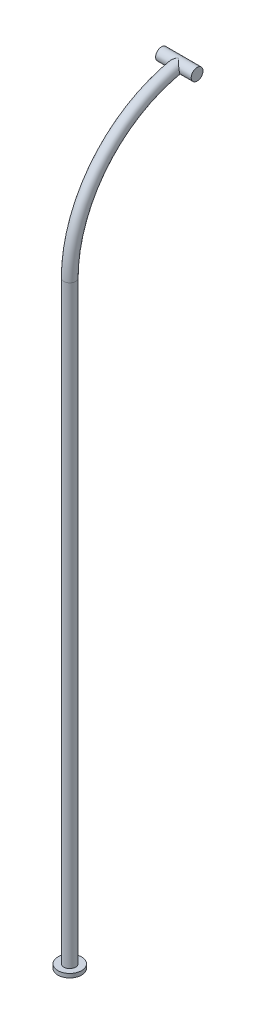
ISO-10303-21;
HEADER;
FILE_DESCRIPTION(('STEP AP214'),'2;1');
FILE_NAME('part.step','',(''),(''),'','','');
FILE_SCHEMA(('AUTOMOTIVE_DESIGN { 1 0 10303 214 1 1 1 1 }'));
ENDSEC;
DATA;
#1=APPLICATION_CONTEXT('core data for automotive mechanical design processes');
#2=APPLICATION_PROTOCOL_DEFINITION('international standard','automotive_design',2000,#1);
#3=PRODUCT_CONTEXT('',#1,'mechanical');
#4=PRODUCT('Part','Part','',(#3));
#5=PRODUCT_RELATED_PRODUCT_CATEGORY('part','',(#4));
#6=PRODUCT_DEFINITION_FORMATION('','',#4);
#7=PRODUCT_DEFINITION_CONTEXT('part definition',#1,'design');
#8=PRODUCT_DEFINITION('design','',#6,#7);
#9=PRODUCT_DEFINITION_SHAPE('','',#8);
#10=(LENGTH_UNIT() NAMED_UNIT(*) SI_UNIT(.MILLI.,.METRE.));
#11=(NAMED_UNIT(*) PLANE_ANGLE_UNIT() SI_UNIT($,.RADIAN.));
#12=(NAMED_UNIT(*) SI_UNIT($,.STERADIAN.) SOLID_ANGLE_UNIT());
#13=UNCERTAINTY_MEASURE_WITH_UNIT(LENGTH_MEASURE(1.E-05),#10,'distance_accuracy_value','');
#14=(GEOMETRIC_REPRESENTATION_CONTEXT(3) GLOBAL_UNCERTAINTY_ASSIGNED_CONTEXT((#13)) GLOBAL_UNIT_ASSIGNED_CONTEXT((#10,
#11,#12)) REPRESENTATION_CONTEXT('',''));
#15=CARTESIAN_POINT('',(0.,0.,0.));
#16=DIRECTION('',(0.,0.,1.));
#17=DIRECTION('',(1.,0.,0.));
#18=AXIS2_PLACEMENT_3D('',#15,#16,#17);
#19=CARTESIAN_POINT('',(0.,150.,0.));
#20=DIRECTION('',(0.,-1.,0.));
#21=DIRECTION('',(0.,0.,-1.));
#22=AXIS2_PLACEMENT_3D('',#19,#20,#21);
#23=CYLINDRICAL_SURFACE('',#22,1.5);
#24=CARTESIAN_POINT('',(0.,150.,0.));
#25=DIRECTION('',(0.,1.,0.));
#26=DIRECTION('',(0.,0.,1.));
#27=AXIS2_PLACEMENT_3D('',#24,#25,#26);
#28=CIRCLE('',#27,1.5);
#29=CARTESIAN_POINT('',(0.,150.,1.5));
#30=VERTEX_POINT('',#29);
#31=EDGE_CURVE('E11',#30,#30,#28,.T.);
#32=ORIENTED_EDGE('',*,*,#31,.F.);
#33=EDGE_LOOP('',(#32));
#34=FACE_BOUND('',#33,.T.);
#35=CARTESIAN_POINT('',(0.,0.,0.));
#36=DIRECTION('',(0.,1.,0.));
#37=DIRECTION('',(0.,0.,1.));
#38=AXIS2_PLACEMENT_3D('',#35,#36,#37);
#39=CIRCLE('',#38,1.5);
#40=CARTESIAN_POINT('',(0.,0.,1.5));
#41=VERTEX_POINT('',#40);
#42=EDGE_CURVE('E35',#41,#41,#39,.T.);
#43=ORIENTED_EDGE('',*,*,#42,.T.);
#44=EDGE_LOOP('',(#43));
#45=FACE_BOUND('',#44,.T.);
#46=ADVANCED_FACE('F32',(#34,#45),#23,.T.);
#47=CARTESIAN_POINT('',(0.,-1.,0.));
#48=DIRECTION('',(0.,1.,0.));
#49=DIRECTION('',(0.,0.,1.));
#50=AXIS2_PLACEMENT_3D('',#47,#48,#49);
#51=CYLINDRICAL_SURFACE('',#50,3.);
#52=CARTESIAN_POINT('',(0.,-1.,0.));
#53=DIRECTION('',(0.,-1.,0.));
#54=DIRECTION('',(0.,0.,-1.));
#55=AXIS2_PLACEMENT_3D('',#52,#53,#54);
#56=CIRCLE('',#55,3.);
#57=CARTESIAN_POINT('',(0.,-1.,-3.));
#58=VERTEX_POINT('',#57);
#59=EDGE_CURVE('E57',#58,#58,#56,.T.);
#60=ORIENTED_EDGE('',*,*,#59,.F.);
#61=EDGE_LOOP('',(#60));
#62=FACE_BOUND('',#61,.T.);
#63=CARTESIAN_POINT('',(0.,0.,0.));
#64=DIRECTION('',(0.,-1.,0.));
#65=DIRECTION('',(0.,0.,-1.));
#66=AXIS2_PLACEMENT_3D('',#63,#64,#65);
#67=CIRCLE('',#66,3.);
#68=CARTESIAN_POINT('',(0.,0.,-3.));
#69=VERTEX_POINT('',#68);
#70=EDGE_CURVE('E54',#69,#69,#67,.T.);
#71=ORIENTED_EDGE('',*,*,#70,.T.);
#72=EDGE_LOOP('',(#71));
#73=FACE_BOUND('',#72,.T.);
#74=ADVANCED_FACE('F87',(#62,#73),#51,.T.);
#75=CARTESIAN_POINT('',(0.,-1.,0.));
#76=DIRECTION('',(0.,-1.,0.));
#77=DIRECTION('',(0.,0.,-1.));
#78=AXIS2_PLACEMENT_3D('',#75,#76,#77);
#79=PLANE('',#78);
#80=ORIENTED_EDGE('',*,*,#59,.T.);
#81=EDGE_LOOP('',(#80));
#82=FACE_BOUND('',#81,.T.);
#83=ADVANCED_FACE('F92',(#82),#79,.T.);
#84=CARTESIAN_POINT('',(0.,0.,0.));
#85=DIRECTION('',(0.,-1.,0.));
#86=DIRECTION('',(0.,0.,-1.));
#87=AXIS2_PLACEMENT_3D('',#84,#85,#86);
#88=PLANE('',#87);
#89=ORIENTED_EDGE('',*,*,#42,.F.);
#90=EDGE_LOOP('',(#89));
#91=FACE_BOUND('',#90,.T.);
#92=ORIENTED_EDGE('',*,*,#70,.F.);
#93=EDGE_LOOP('',(#92));
#94=FACE_BOUND('',#93,.T.);
#95=ADVANCED_FACE('F105',(#91,#94),#88,.F.);
#96=CARTESIAN_POINT('',(0.,150.,-33.5));
#97=DIRECTION('',(1.,0.,0.));
#98=DIRECTION('',(0.,0.,-1.));
#99=AXIS2_PLACEMENT_3D('',#96,#97,#98);
#100=TOROIDAL_SURFACE('',#99,33.5,1.5);
#101=CARTESIAN_POINT('',(0.,184.468271355427,-27.4223137816575));
#102=CARTESIAN_POINT('',(-0.0018455700807971,184.467943771681,-27.4204560058939));
#103=CARTESIAN_POINT('',(-0.00369119618615408,184.467612681176,-27.418598790246));
#104=CARTESIAN_POINT('',(-0.117236752986712,184.447028324668,-27.3043782216821));
#105=CARTESIAN_POINT('',(-0.229114545353076,184.413934769553,-27.1940972541607));
#106=CARTESIAN_POINT('',(-0.450167280180582,184.321985418649,-26.9812724865205));
#107=CARTESIAN_POINT('',(-0.559335695353354,184.263072789314,-26.8787463436305));
#108=CARTESIAN_POINT('',(-0.741816339629486,184.138437283195,-26.7126643590827));
#109=CARTESIAN_POINT('',(-0.816740553529652,184.079030491823,-26.6461399004851));
#110=CARTESIAN_POINT('',(-0.960834204534892,183.945645295398,-26.5221694214755));
#111=CARTESIAN_POINT('',(-1.03001612614331,183.871699746004,-26.4647034481776));
#112=CARTESIAN_POINT('',(-1.14273518511408,183.730028512423,-26.3754993125735));
#113=CARTESIAN_POINT('',(-1.18826908749949,183.665666180124,-26.3409542883607));
#114=CARTESIAN_POINT('',(-1.27266401355297,183.528928810461,-26.2805509156627));
#115=CARTESIAN_POINT('',(-1.31153339372174,183.456563997418,-26.2546816493207));
#116=CARTESIAN_POINT('',(-1.37321158242012,183.320304931743,-26.2180316917124));
#117=CARTESIAN_POINT('',(-1.39767927334743,183.257707811747,-26.2052465965705));
#118=CARTESIAN_POINT('',(-1.43953985941922,183.129078400923,-26.1877433182874));
#119=CARTESIAN_POINT('',(-1.45693745222111,183.063048424035,-26.1830197720302));
#120=CARTESIAN_POINT('',(-1.48346461159684,182.928763457495,-26.1825679557935));
#121=CARTESIAN_POINT('',(-1.49253356956041,182.86049584431,-26.1869048849103));
#122=CARTESIAN_POINT('',(-1.50129804899405,182.724622755612,-26.2050515110252));
#123=CARTESIAN_POINT('',(-1.50099879563853,182.657016932031,-26.2188559232768));
#124=CARTESIAN_POINT('',(-1.49157787227115,182.532726366524,-26.2532405987497));
#125=CARTESIAN_POINT('',(-1.48348741594787,182.47568652385,-26.2728448592982));
#126=CARTESIAN_POINT('',(-1.46048849656692,182.365551024773,-26.3181302422252));
#127=CARTESIAN_POINT('',(-1.44557906022225,182.312455932671,-26.3438122318377));
#128=CARTESIAN_POINT('',(-1.40922059833972,182.209559484664,-26.4010538738837));
#129=CARTESIAN_POINT('',(-1.38757698661736,182.15991860127,-26.4327757576798));
#130=CARTESIAN_POINT('',(-1.33901214455986,182.066363504146,-26.5003006615747));
#131=CARTESIAN_POINT('',(-1.31208831928667,182.022452123898,-26.5361056846791));
#132=CARTESIAN_POINT('',(-1.23810795998544,181.918053132926,-26.6311203721736));
#133=CARTESIAN_POINT('',(-1.18807950143997,181.86158563168,-26.6924448961051));
#134=CARTESIAN_POINT('',(-1.08086971168538,181.761769125044,-26.8194203058563));
#135=CARTESIAN_POINT('',(-1.02366946922006,181.718455879489,-26.8850824044393));
#136=CARTESIAN_POINT('',(-0.880243458258809,181.628803488579,-27.0457516762444));
#137=CARTESIAN_POINT('',(-0.791633956613924,181.58832353005,-27.1418880756447));
#138=CARTESIAN_POINT('',(-0.608933600065306,181.528355639259,-27.3352854637371));
#139=CARTESIAN_POINT('',(-0.514839483169545,181.508880336669,-27.4325470935274));
#140=CARTESIAN_POINT('',(-0.351278026015756,181.491836263022,-27.5983272439974));
#141=CARTESIAN_POINT('',(-0.282486170636511,181.489587062432,-27.6670902088798));
#142=CARTESIAN_POINT('',(-0.144296015823579,181.494370639898,-27.8034873341352));
#143=CARTESIAN_POINT('',(-0.0748990069566405,181.501386977978,-27.8711232787755));
#144=CARTESIAN_POINT('',(-0.00369302848086276,181.513224541409,-27.9397031814824));
#145=CARTESIAN_POINT('',(-0.00184649713791916,181.513534720144,-27.9414810469466));
#146=CARTESIAN_POINT('',(0.,181.513848096391,-27.9432583146583));
#147=B_SPLINE_CURVE_WITH_KNOTS('',3,(#101,#102,#103,#104,#105,#106,#107,#108,#109,#110,#111,
#112,#113,#114,#115,#116,#117,#118,#119,#120,#121,#122,#123,#124,#125,#126,#127,#128,#129,#130,
#131,#132,#133,#134,#135,#136,#137,#138,#139,#140,#141,#142,#143,#144,#145,#146),.UNSPECIFIED.,
.F.,.F.,(4,2,2,2,2,2,2,2,2,2,2,2,2,2,2,2,2,2,2,2,2,2,4),(0.,0.00791749209999727,
0.487082614778101,0.96730782641133,1.31561813730153,1.66315017769124,1.92052040451129,
2.17756552214118,2.38200785095779,2.58631411709556,2.79209563160856,2.99776237232942,
3.17948418892788,3.3612319511524,3.54881473479251,3.73648993723761,4.0265163370424,
4.31732425781116,4.72572981565763,5.13438080279548,5.42584733904259,5.71679741627866,
5.72454338913382),.UNSPECIFIED.);
#148=CARTESIAN_POINT('',(0.,184.468271355427,-27.4223137816575));
#149=VERTEX_POINT('',#148);
#150=CARTESIAN_POINT('',(0.,181.513848096391,-27.9432583146583));
#151=VERTEX_POINT('',#150);
#152=EDGE_CURVE('E47',#149,#151,#147,.T.);
#153=ORIENTED_EDGE('',*,*,#152,.T.);
#154=CARTESIAN_POINT('',(0.,181.513848096391,-27.9432583146583));
#155=CARTESIAN_POINT('',(0.00184645316394581,181.513534732483,-27.9414810884646));
#156=CARTESIAN_POINT('',(0.00369298482835929,181.513224553499,-27.9397032227256));
#157=CARTESIAN_POINT('',(0.124339664367057,181.493167456672,-27.823506043847));
#158=CARTESIAN_POINT('',(0.243429358941571,181.486611368485,-27.7064697093308));
#159=CARTESIAN_POINT('',(0.419281094860678,181.497725754173,-27.5296338372603));
#160=CARTESIAN_POINT('',(0.477525527231789,181.504950407236,-27.4703791059745));
#161=CARTESIAN_POINT('',(0.592561734397858,181.526785695944,-27.3518348200158));
#162=CARTESIAN_POINT('',(0.649354393667694,181.541391716196,-27.2925453102));
#163=CARTESIAN_POINT('',(0.779559264266443,181.584693518915,-27.1546016703852));
#164=CARTESIAN_POINT('',(0.852161576342762,181.61647099201,-27.076117856286));
#165=CARTESIAN_POINT('',(0.991398120761783,181.695526874958,-26.9218099852681));
#166=CARTESIAN_POINT('',(1.05804550205117,181.742770001865,-26.845980305122));
#167=CARTESIAN_POINT('',(1.16657305008264,181.840293809683,-26.7181823981679));
#168=CARTESIAN_POINT('',(1.21045261959675,181.88677998864,-26.6650320912645));
#169=CARTESIAN_POINT('',(1.29131121555271,181.989895344371,-26.5634613673106));
#170=CARTESIAN_POINT('',(1.32829888898133,182.046511633974,-26.5150350601125));
#171=CARTESIAN_POINT('',(1.38661289528502,182.157487641822,-26.4342340343262));
#172=CARTESIAN_POINT('',(1.4095916223754,182.210042499448,-26.4005846773188));
#173=CARTESIAN_POINT('',(1.44838299451989,182.320996280184,-26.3392751544068));
#174=CARTESIAN_POINT('',(1.46420073375272,182.379391012708,-26.311610738277));
#175=CARTESIAN_POINT('',(1.48765459823326,182.501111572784,-26.2635419664258));
#176=CARTESIAN_POINT('',(1.49524066188511,182.564465087925,-26.2431825320189));
#177=CARTESIAN_POINT('',(1.50147440979303,182.693736749746,-26.2110422317553));
#178=CARTESIAN_POINT('',(1.50012449635722,182.759654202412,-26.1992590612395));
#179=CARTESIAN_POINT('',(1.48925753633206,182.88526701653,-26.1853170707429));
#180=CARTESIAN_POINT('',(1.4805448764834,182.944946113397,-26.1823360150494));
#181=CARTESIAN_POINT('',(1.45664817664316,183.0629105206,-26.1833464835935));
#182=CARTESIAN_POINT('',(1.44146305880257,183.121195597082,-26.1873391695013));
#183=CARTESIAN_POINT('',(1.40446636317091,183.238464215034,-26.2020819647633));
#184=CARTESIAN_POINT('',(1.38232264524409,183.297293577947,-26.2132091356561));
#185=CARTESIAN_POINT('',(1.33290006633326,183.411157373235,-26.2416169118737));
#186=CARTESIAN_POINT('',(1.30561829303476,183.46618962907,-26.2589010120009));
#187=CARTESIAN_POINT('',(1.23093165457193,183.600816134185,-26.3095355472441));
#188=CARTESIAN_POINT('',(1.18065855168531,183.677467383283,-26.346509627267));
#189=CARTESIAN_POINT('',(1.0732247492083,183.820071157485,-26.4299496642392));
#190=CARTESIAN_POINT('',(1.01604682904584,183.885995929005,-26.4764395627457));
#191=CARTESIAN_POINT('',(0.875437348616066,184.029122075188,-26.5947210428988));
#192=CARTESIAN_POINT('',(0.789984780646128,184.101790670278,-26.6695851310492));
#193=CARTESIAN_POINT('',(0.613981627036115,184.228208028432,-26.8285119161112));
#194=CARTESIAN_POINT('',(0.523428177894887,184.281946039081,-26.9125798052896));
#195=CARTESIAN_POINT('',(0.361513639745505,184.360554037093,-27.0662981580296));
#196=CARTESIAN_POINT('',(0.290706467901725,184.389249624625,-27.1346261765933));
#197=CARTESIAN_POINT('',(0.14842825997832,184.436127801862,-27.2739275700605));
#198=CARTESIAN_POINT('',(0.0769587187590525,184.454330015802,-27.3448957410107));
#199=CARTESIAN_POINT('',(0.00369121283508602,184.467612683353,-27.4185987725137));
#200=CARTESIAN_POINT('',(0.00184558665391748,184.467943774064,-27.4204559882026));
#201=CARTESIAN_POINT('',(0.,184.468271355427,-27.4223137816575));
#202=B_SPLINE_CURVE_WITH_KNOTS('',3,(#154,#155,#156,#157,#158,#159,#160,#161,#162,#163,#164,
#165,#166,#167,#168,#169,#170,#171,#172,#173,#174,#175,#176,#177,#178,#179,#180,#181,#182,#183,
#184,#185,#186,#187,#188,#189,#190,#191,#192,#193,#194,#195,#196,#197,#198,#199,#200,#201),
.UNSPECIFIED.,.F.,.F.,(4,2,2,2,2,2,2,2,2,2,2,2,2,2,2,2,2,2,2,2,2,2,2,4),(0.,0.00774597285516231,
0.506078780254885,0.756046703034727,1.00585851983879,1.339402651399,1.67219108592712,
1.92075915502725,2.16901322421938,2.36771980543497,2.56628480791733,2.76605074596314,
2.96576298200906,3.14611560612347,3.32649827583901,3.5173019465527,3.70821409446849,
4.00308345913986,4.298704033739,4.7011432880829,5.10381075744626,5.41077168964996,
5.7171566792711,5.72507417137109),.UNSPECIFIED.);
#203=EDGE_CURVE('E45',#151,#149,#202,.T.);
#204=ORIENTED_EDGE('',*,*,#203,.T.);
#205=EDGE_LOOP('',(#153,#204));
#206=FACE_BOUND('',#205,.T.);
#207=ORIENTED_EDGE('',*,*,#31,.T.);
#208=EDGE_LOOP('',(#207));
#209=FACE_BOUND('',#208,.T.);
#210=ADVANCED_FACE('F52',(#206,#209),#100,.T.);
#211=CARTESIAN_POINT('',(-4.5,182.991059725909,-27.6827860481579));
#212=DIRECTION('',(1.,0.,0.));
#213=DIRECTION('',(0.,0.,-1.));
#214=AXIS2_PLACEMENT_3D('',#211,#212,#213);
#215=CYLINDRICAL_SURFACE('',#214,1.5);
#216=CARTESIAN_POINT('',(4.5,182.991059725909,-27.6827860481579));
#217=DIRECTION('',(1.,0.,0.));
#218=DIRECTION('',(0.,0.,-1.));
#219=AXIS2_PLACEMENT_3D('',#216,#217,#218);
#220=CIRCLE('',#219,1.5);
#221=CARTESIAN_POINT('',(4.5,182.991059725909,-29.1827860481579));
#222=VERTEX_POINT('',#221);
#223=EDGE_CURVE('E155',#222,#222,#220,.T.);
#224=ORIENTED_EDGE('',*,*,#223,.F.);
#225=EDGE_LOOP('',(#224));
#226=FACE_BOUND('',#225,.T.);
#227=CARTESIAN_POINT('',(-4.5,182.991059725909,-27.6827860481579));
#228=DIRECTION('',(1.,0.,0.));
#229=DIRECTION('',(0.,0.,-1.));
#230=AXIS2_PLACEMENT_3D('',#227,#228,#229);
#231=CIRCLE('',#230,1.5);
#232=CARTESIAN_POINT('',(-4.5,182.991059725909,-29.1827860481579));
#233=VERTEX_POINT('',#232);
#234=EDGE_CURVE('E50',#233,#233,#231,.T.);
#235=ORIENTED_EDGE('',*,*,#234,.T.);
#236=EDGE_LOOP('',(#235));
#237=FACE_BOUND('',#236,.T.);
#238=ORIENTED_EDGE('',*,*,#203,.F.);
#239=ORIENTED_EDGE('',*,*,#152,.F.);
#240=EDGE_LOOP('',(#238,#239));
#241=FACE_BOUND('',#240,.T.);
#242=ADVANCED_FACE('F48',(#226,#237,#241),#215,.T.);
#243=CARTESIAN_POINT('',(-4.5,182.991059725909,-27.6827860481579));
#244=DIRECTION('',(1.,0.,0.));
#245=DIRECTION('',(0.,0.,-1.));
#246=AXIS2_PLACEMENT_3D('',#243,#244,#245);
#247=PLANE('',#246);
#248=ORIENTED_EDGE('',*,*,#234,.F.);
#249=EDGE_LOOP('',(#248));
#250=FACE_BOUND('',#249,.T.);
#251=ADVANCED_FACE('F74',(#250),#247,.F.);
#252=CARTESIAN_POINT('',(4.5,182.991059725909,-27.6827860481579));
#253=DIRECTION('',(1.,0.,0.));
#254=DIRECTION('',(0.,0.,-1.));
#255=AXIS2_PLACEMENT_3D('',#252,#253,#254);
#256=PLANE('',#255);
#257=ORIENTED_EDGE('',*,*,#223,.T.);
#258=EDGE_LOOP('',(#257));
#259=FACE_BOUND('',#258,.T.);
#260=ADVANCED_FACE('F79',(#259),#256,.T.);
#261=CLOSED_SHELL('',(#46,#74,#83,#95,#210,#242,#251,#260));
#262=MANIFOLD_SOLID_BREP('B2',#261);
#263=ADVANCED_BREP_SHAPE_REPRESENTATION('',(#18,#262),#14);
#264=SHAPE_DEFINITION_REPRESENTATION(#9,#263);
ENDSEC;
END-ISO-10303-21;
